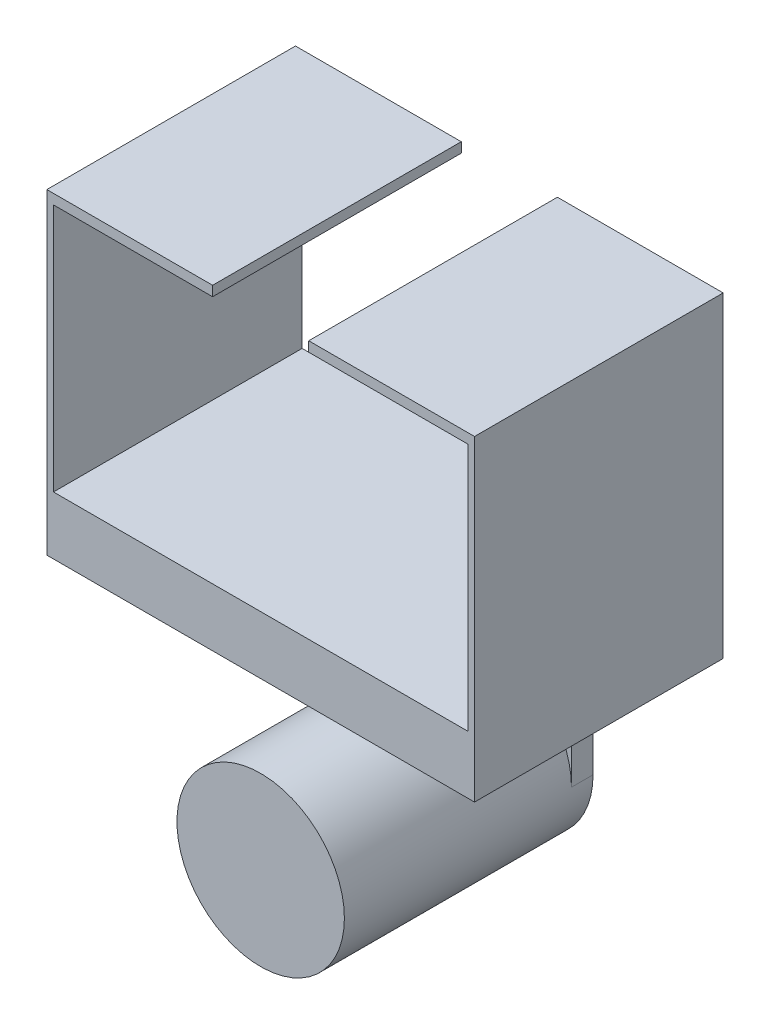
ISO-10303-21;
HEADER;
FILE_DESCRIPTION(('STEP AP214'),'2;1');
FILE_NAME('part.step','',(''),(''),'','','');
FILE_SCHEMA(('AUTOMOTIVE_DESIGN { 1 0 10303 214 1 1 1 1 }'));
ENDSEC;
DATA;
#1=APPLICATION_CONTEXT('core data for automotive mechanical design processes');
#2=APPLICATION_PROTOCOL_DEFINITION('international standard','automotive_design',2000,#1);
#3=PRODUCT_CONTEXT('',#1,'mechanical');
#4=PRODUCT('Part','Part','',(#3));
#5=PRODUCT_RELATED_PRODUCT_CATEGORY('part','',(#4));
#6=PRODUCT_DEFINITION_FORMATION('','',#4);
#7=PRODUCT_DEFINITION_CONTEXT('part definition',#1,'design');
#8=PRODUCT_DEFINITION('design','',#6,#7);
#9=PRODUCT_DEFINITION_SHAPE('','',#8);
#10=(LENGTH_UNIT() NAMED_UNIT(*) SI_UNIT(.MILLI.,.METRE.));
#11=(NAMED_UNIT(*) PLANE_ANGLE_UNIT() SI_UNIT($,.RADIAN.));
#12=(NAMED_UNIT(*) SI_UNIT($,.STERADIAN.) SOLID_ANGLE_UNIT());
#13=UNCERTAINTY_MEASURE_WITH_UNIT(LENGTH_MEASURE(1.E-05),#10,'distance_accuracy_value','');
#14=(GEOMETRIC_REPRESENTATION_CONTEXT(3) GLOBAL_UNCERTAINTY_ASSIGNED_CONTEXT((#13)) GLOBAL_UNIT_ASSIGNED_CONTEXT((#10,
#11,#12)) REPRESENTATION_CONTEXT('',''));
#15=CARTESIAN_POINT('',(0.,0.,0.));
#16=DIRECTION('',(0.,0.,1.));
#17=DIRECTION('',(1.,0.,0.));
#18=AXIS2_PLACEMENT_3D('',#15,#16,#17);
#19=CARTESIAN_POINT('',(0.,-30.1017640511618,38.1));
#20=DIRECTION('',(0.,0.,-1.));
#21=DIRECTION('',(-1.,0.,0.));
#22=AXIS2_PLACEMENT_3D('',#19,#20,#21);
#23=CYLINDRICAL_SURFACE('',#22,12.827);
#24=CARTESIAN_POINT('',(0.,-30.1017640511618,38.1));
#25=DIRECTION('',(0.,0.,1.));
#26=DIRECTION('',(1.,0.,0.));
#27=AXIS2_PLACEMENT_3D('',#24,#25,#26);
#28=CIRCLE('',#27,12.827);
#29=CARTESIAN_POINT('',(12.827,-30.1017640511618,38.1));
#30=VERTEX_POINT('',#29);
#31=EDGE_CURVE('E55',#30,#30,#28,.T.);
#32=ORIENTED_EDGE('',*,*,#31,.F.);
#33=EDGE_LOOP('',(#32));
#34=FACE_BOUND('',#33,.T.);
#35=DIRECTION('',(0.,0.,-1.));
#36=VECTOR('',#35,1.);
#37=CARTESIAN_POINT('',(-12.827,-30.1017640511618,3.302));
#38=LINE('',#37,#36);
#39=CARTESIAN_POINT('',(-12.827,-30.1017640511618,3.302));
#40=VERTEX_POINT('',#39);
#41=CARTESIAN_POINT('',(-12.827,-30.1017640511618,0.));
#42=VERTEX_POINT('',#41);
#43=EDGE_CURVE('E327',#40,#42,#38,.T.);
#44=ORIENTED_EDGE('',*,*,#43,.T.);
#45=CARTESIAN_POINT('',(0.,-30.1017640511618,0.));
#46=DIRECTION('',(0.,0.,1.));
#47=DIRECTION('',(1.,0.,0.));
#48=AXIS2_PLACEMENT_3D('',#45,#46,#47);
#49=CIRCLE('',#48,12.827);
#50=CARTESIAN_POINT('',(12.827,-30.1017640511618,0.));
#51=VERTEX_POINT('',#50);
#52=EDGE_CURVE('E330',#42,#51,#49,.T.);
#53=ORIENTED_EDGE('',*,*,#52,.T.);
#54=DIRECTION('',(0.,0.,-1.));
#55=VECTOR('',#54,1.);
#56=CARTESIAN_POINT('',(12.827,-30.1017640511618,3.302));
#57=LINE('',#56,#55);
#58=CARTESIAN_POINT('',(12.827,-30.1017640511618,3.302));
#59=VERTEX_POINT('',#58);
#60=EDGE_CURVE('E62',#59,#51,#57,.T.);
#61=ORIENTED_EDGE('',*,*,#60,.F.);
#62=CARTESIAN_POINT('',(0.,-30.1017640511618,3.302));
#63=DIRECTION('',(0.,0.,-1.));
#64=DIRECTION('',(-1.,0.,0.));
#65=AXIS2_PLACEMENT_3D('',#62,#63,#64);
#66=CIRCLE('',#65,12.827);
#67=EDGE_CURVE('E11',#40,#59,#66,.T.);
#68=ORIENTED_EDGE('',*,*,#67,.F.);
#69=EDGE_LOOP('',(#44,#53,#61,#68));
#70=FACE_BOUND('',#69,.T.);
#71=ADVANCED_FACE('F47',(#34,#70),#23,.T.);
#72=CARTESIAN_POINT('',(0.,-30.1017640511618,38.1));
#73=DIRECTION('',(0.,0.,1.));
#74=DIRECTION('',(1.,0.,0.));
#75=AXIS2_PLACEMENT_3D('',#72,#73,#74);
#76=PLANE('',#75);
#77=ORIENTED_EDGE('',*,*,#31,.T.);
#78=EDGE_LOOP('',(#77));
#79=FACE_BOUND('',#78,.T.);
#80=ADVANCED_FACE('F497',(#79),#76,.T.);
#81=CARTESIAN_POINT('',(0.,-30.1017640511618,0.));
#82=DIRECTION('',(0.,0.,1.));
#83=DIRECTION('',(1.,0.,0.));
#84=AXIS2_PLACEMENT_3D('',#81,#82,#83);
#85=PLANE('',#84);
#86=ORIENTED_EDGE('',*,*,#52,.F.);
#87=DIRECTION('',(0.,-1.,0.));
#88=VECTOR('',#87,1.);
#89=CARTESIAN_POINT('',(-12.827,-30.1017640511618,0.));
#90=LINE('',#89,#88);
#91=CARTESIAN_POINT('',(-12.827,-4.70176405116185,0.));
#92=VERTEX_POINT('',#91);
#93=EDGE_CURVE('E296',#92,#42,#90,.T.);
#94=ORIENTED_EDGE('',*,*,#93,.F.);
#95=DIRECTION('',(-1.,0.,0.));
#96=VECTOR('',#95,1.);
#97=CARTESIAN_POINT('',(-31.75,-4.70176405116185,0.));
#98=LINE('',#97,#96);
#99=CARTESIAN_POINT('',(-32.766,-4.70176405116185,0.));
#100=VERTEX_POINT('',#99);
#101=EDGE_CURVE('E299',#92,#100,#98,.T.);
#102=ORIENTED_EDGE('',*,*,#101,.T.);
#103=DIRECTION('',(0.,-1.,0.));
#104=VECTOR('',#103,1.);
#105=CARTESIAN_POINT('',(-32.766,-4.70176405116185,0.));
#106=LINE('',#105,#104);
#107=CARTESIAN_POINT('',(-32.766,43.8122359488382,0.));
#108=VERTEX_POINT('',#107);
#109=EDGE_CURVE('E168',#108,#100,#106,.T.);
#110=ORIENTED_EDGE('',*,*,#109,.F.);
#111=DIRECTION('',(-1.,0.,0.));
#112=VECTOR('',#111,1.);
#113=CARTESIAN_POINT('',(-32.766,43.8122359488382,0.));
#114=LINE('',#113,#112);
#115=CARTESIAN_POINT('',(-7.366,43.8122359488382,0.));
#116=VERTEX_POINT('',#115);
#117=EDGE_CURVE('E184',#116,#108,#114,.T.);
#118=ORIENTED_EDGE('',*,*,#117,.F.);
#119=DIRECTION('',(0.,-1.,0.));
#120=VECTOR('',#119,1.);
#121=CARTESIAN_POINT('',(-7.366,43.8122359488382,0.));
#122=LINE('',#121,#120);
#123=CARTESIAN_POINT('',(-7.366,42.2882359488382,0.));
#124=VERTEX_POINT('',#123);
#125=EDGE_CURVE('E199',#116,#124,#122,.T.);
#126=ORIENTED_EDGE('',*,*,#125,.T.);
#127=DIRECTION('',(-1.,0.,0.));
#128=VECTOR('',#127,1.);
#129=CARTESIAN_POINT('',(-32.766,42.2882359488382,0.));
#130=LINE('',#129,#128);
#131=CARTESIAN_POINT('',(-31.75,42.2882359488382,0.));
#132=VERTEX_POINT('',#131);
#133=EDGE_CURVE('E186',#124,#132,#130,.T.);
#134=ORIENTED_EDGE('',*,*,#133,.T.);
#135=DIRECTION('',(0.,-1.,0.));
#136=VECTOR('',#135,1.);
#137=CARTESIAN_POINT('',(-31.75,-4.70176405116185,0.));
#138=LINE('',#137,#136);
#139=CARTESIAN_POINT('',(-31.75,4.18823594883815,0.));
#140=VERTEX_POINT('',#139);
#141=EDGE_CURVE('E169',#132,#140,#138,.T.);
#142=ORIENTED_EDGE('',*,*,#141,.T.);
#143=DIRECTION('',(-1.,0.,0.));
#144=VECTOR('',#143,1.);
#145=CARTESIAN_POINT('',(-31.75,4.18823594883815,0.));
#146=LINE('',#145,#144);
#147=CARTESIAN_POINT('',(31.75,4.18823594883815,0.));
#148=VERTEX_POINT('',#147);
#149=EDGE_CURVE('E292',#148,#140,#146,.T.);
#150=ORIENTED_EDGE('',*,*,#149,.F.);
#151=DIRECTION('',(0.,1.,0.));
#152=VECTOR('',#151,1.);
#153=CARTESIAN_POINT('',(31.75,-4.70176405116185,0.));
#154=LINE('',#153,#152);
#155=CARTESIAN_POINT('',(31.75,42.2882359488382,0.));
#156=VERTEX_POINT('',#155);
#157=EDGE_CURVE('E273',#148,#156,#154,.T.);
#158=ORIENTED_EDGE('',*,*,#157,.T.);
#159=DIRECTION('',(-1.,0.,0.));
#160=VECTOR('',#159,1.);
#161=CARTESIAN_POINT('',(32.766,42.2882359488382,0.));
#162=LINE('',#161,#160);
#163=CARTESIAN_POINT('',(7.36600000000001,42.2882359488382,0.));
#164=VERTEX_POINT('',#163);
#165=EDGE_CURVE('E210',#156,#164,#162,.T.);
#166=ORIENTED_EDGE('',*,*,#165,.T.);
#167=DIRECTION('',(0.,-1.,0.));
#168=VECTOR('',#167,1.);
#169=CARTESIAN_POINT('',(7.36600000000001,43.8122359488382,0.));
#170=LINE('',#169,#168);
#171=CARTESIAN_POINT('',(7.36600000000001,43.8122359488382,0.));
#172=VERTEX_POINT('',#171);
#173=EDGE_CURVE('E238',#172,#164,#170,.T.);
#174=ORIENTED_EDGE('',*,*,#173,.F.);
#175=DIRECTION('',(-1.,0.,0.));
#176=VECTOR('',#175,1.);
#177=CARTESIAN_POINT('',(32.766,43.8122359488382,0.));
#178=LINE('',#177,#176);
#179=CARTESIAN_POINT('',(32.766,43.8122359488382,0.));
#180=VERTEX_POINT('',#179);
#181=EDGE_CURVE('E215',#180,#172,#178,.T.);
#182=ORIENTED_EDGE('',*,*,#181,.F.);
#183=DIRECTION('',(0.,1.,0.));
#184=VECTOR('',#183,1.);
#185=CARTESIAN_POINT('',(32.766,-4.70176405116185,0.));
#186=LINE('',#185,#184);
#187=CARTESIAN_POINT('',(32.766,-4.70176405116185,0.));
#188=VERTEX_POINT('',#187);
#189=EDGE_CURVE('E266',#188,#180,#186,.T.);
#190=ORIENTED_EDGE('',*,*,#189,.F.);
#191=CARTESIAN_POINT('',(12.827,-4.70176405116185,0.));
#192=VERTEX_POINT('',#191);
#193=EDGE_CURVE('E284',#188,#192,#98,.T.);
#194=ORIENTED_EDGE('',*,*,#193,.T.);
#195=DIRECTION('',(0.,1.,0.));
#196=VECTOR('',#195,1.);
#197=CARTESIAN_POINT('',(12.827,-30.1017640511618,0.));
#198=LINE('',#197,#196);
#199=EDGE_CURVE('E307',#51,#192,#198,.T.);
#200=ORIENTED_EDGE('',*,*,#199,.F.);
#201=EDGE_LOOP('',(#86,#94,#102,#110,#118,#126,#134,#142,#150,#158,#166,#174,#182,#190,#194,#200));
#202=FACE_BOUND('',#201,.T.);
#203=ADVANCED_FACE('F344',(#202),#85,.F.);
#204=CARTESIAN_POINT('',(-12.827,-30.1017640511618,3.302));
#205=DIRECTION('',(1.,0.,0.));
#206=DIRECTION('',(0.,0.,-1.));
#207=AXIS2_PLACEMENT_3D('',#204,#205,#206);
#208=PLANE('',#207);
#209=ORIENTED_EDGE('',*,*,#93,.T.);
#210=ORIENTED_EDGE('',*,*,#43,.F.);
#211=DIRECTION('',(0.,-1.,0.));
#212=VECTOR('',#211,1.);
#213=CARTESIAN_POINT('',(-12.827,-30.1017640511618,3.302));
#214=LINE('',#213,#212);
#215=CARTESIAN_POINT('',(-12.827,-4.70176405116185,3.302));
#216=VERTEX_POINT('',#215);
#217=EDGE_CURVE('E303',#216,#40,#214,.T.);
#218=ORIENTED_EDGE('',*,*,#217,.F.);
#219=DIRECTION('',(0.,0.,-1.));
#220=VECTOR('',#219,1.);
#221=CARTESIAN_POINT('',(-12.827,-4.70176405116185,3.302));
#222=LINE('',#221,#220);
#223=EDGE_CURVE('E313',#216,#92,#222,.T.);
#224=ORIENTED_EDGE('',*,*,#223,.T.);
#225=EDGE_LOOP('',(#209,#210,#218,#224));
#226=FACE_BOUND('',#225,.T.);
#227=ADVANCED_FACE('F484',(#226),#208,.F.);
#228=CARTESIAN_POINT('',(12.827,-30.1017640511618,3.302));
#229=DIRECTION('',(-1.,0.,0.));
#230=DIRECTION('',(0.,0.,1.));
#231=AXIS2_PLACEMENT_3D('',#228,#229,#230);
#232=PLANE('',#231);
#233=ORIENTED_EDGE('',*,*,#199,.T.);
#234=DIRECTION('',(0.,0.,-1.));
#235=VECTOR('',#234,1.);
#236=CARTESIAN_POINT('',(12.827,-4.70176405116185,3.302));
#237=LINE('',#236,#235);
#238=CARTESIAN_POINT('',(12.827,-4.70176405116185,3.302));
#239=VERTEX_POINT('',#238);
#240=EDGE_CURVE('E321',#239,#192,#237,.T.);
#241=ORIENTED_EDGE('',*,*,#240,.F.);
#242=DIRECTION('',(0.,1.,0.));
#243=VECTOR('',#242,1.);
#244=CARTESIAN_POINT('',(12.827,-30.1017640511618,3.302));
#245=LINE('',#244,#243);
#246=EDGE_CURVE('E306',#59,#239,#245,.T.);
#247=ORIENTED_EDGE('',*,*,#246,.F.);
#248=ORIENTED_EDGE('',*,*,#60,.T.);
#249=EDGE_LOOP('',(#233,#241,#247,#248));
#250=FACE_BOUND('',#249,.T.);
#251=ADVANCED_FACE('F342',(#250),#232,.F.);
#252=CARTESIAN_POINT('',(0.,0.,3.302));
#253=DIRECTION('',(0.,0.,-1.));
#254=DIRECTION('',(-1.,0.,0.));
#255=AXIS2_PLACEMENT_3D('',#252,#253,#254);
#256=PLANE('',#255);
#257=ORIENTED_EDGE('',*,*,#217,.T.);
#258=ORIENTED_EDGE('',*,*,#67,.T.);
#259=ORIENTED_EDGE('',*,*,#246,.T.);
#260=DIRECTION('',(-1.,0.,0.));
#261=VECTOR('',#260,1.);
#262=CARTESIAN_POINT('',(-12.827,-4.70176405116185,3.302));
#263=LINE('',#262,#261);
#264=EDGE_CURVE('E310',#239,#216,#263,.T.);
#265=ORIENTED_EDGE('',*,*,#264,.T.);
#266=EDGE_LOOP('',(#257,#258,#259,#265));
#267=FACE_BOUND('',#266,.T.);
#268=ADVANCED_FACE('F486',(#267),#256,.F.);
#269=CARTESIAN_POINT('',(-31.75,4.18823594883815,38.1));
#270=DIRECTION('',(0.,0.,-1.));
#271=DIRECTION('',(-1.,0.,0.));
#272=AXIS2_PLACEMENT_3D('',#269,#270,#271);
#273=PLANE('',#272);
#274=DIRECTION('',(1.,0.,0.));
#275=VECTOR('',#274,1.);
#276=CARTESIAN_POINT('',(-31.75,-4.70176405116185,38.1));
#277=LINE('',#276,#275);
#278=CARTESIAN_POINT('',(-32.766,-4.70176405116185,38.1));
#279=VERTEX_POINT('',#278);
#280=CARTESIAN_POINT('',(32.766,-4.70176405116185,38.1));
#281=VERTEX_POINT('',#280);
#282=EDGE_CURVE('E269',#279,#281,#277,.T.);
#283=ORIENTED_EDGE('',*,*,#282,.T.);
#284=DIRECTION('',(0.,-1.,0.));
#285=VECTOR('',#284,1.);
#286=CARTESIAN_POINT('',(32.766,-4.70176405116185,38.1));
#287=LINE('',#286,#285);
#288=CARTESIAN_POINT('',(32.766,43.8122359488382,38.1));
#289=VERTEX_POINT('',#288);
#290=EDGE_CURVE('E257',#289,#281,#287,.T.);
#291=ORIENTED_EDGE('',*,*,#290,.F.);
#292=DIRECTION('',(1.,0.,0.));
#293=VECTOR('',#292,1.);
#294=CARTESIAN_POINT('',(32.766,43.8122359488382,38.1));
#295=LINE('',#294,#293);
#296=CARTESIAN_POINT('',(7.36600000000002,43.8122359488382,38.1));
#297=VERTEX_POINT('',#296);
#298=EDGE_CURVE('E222',#297,#289,#295,.T.);
#299=ORIENTED_EDGE('',*,*,#298,.F.);
#300=DIRECTION('',(0.,-1.,0.));
#301=VECTOR('',#300,1.);
#302=CARTESIAN_POINT('',(7.36600000000002,43.8122359488382,38.1));
#303=LINE('',#302,#301);
#304=CARTESIAN_POINT('',(7.36600000000002,42.2882359488382,38.1));
#305=VERTEX_POINT('',#304);
#306=EDGE_CURVE('E226',#297,#305,#303,.T.);
#307=ORIENTED_EDGE('',*,*,#306,.T.);
#308=DIRECTION('',(1.,0.,0.));
#309=VECTOR('',#308,1.);
#310=CARTESIAN_POINT('',(32.766,42.2882359488382,38.1));
#311=LINE('',#310,#309);
#312=CARTESIAN_POINT('',(31.75,42.2882359488382,38.1));
#313=VERTEX_POINT('',#312);
#314=EDGE_CURVE('E216',#305,#313,#311,.T.);
#315=ORIENTED_EDGE('',*,*,#314,.T.);
#316=DIRECTION('',(0.,-1.,0.));
#317=VECTOR('',#316,1.);
#318=CARTESIAN_POINT('',(31.75,-4.70176405116185,38.1));
#319=LINE('',#318,#317);
#320=CARTESIAN_POINT('',(31.75,4.18823594883815,38.1));
#321=VERTEX_POINT('',#320);
#322=EDGE_CURVE('E247',#313,#321,#319,.T.);
#323=ORIENTED_EDGE('',*,*,#322,.T.);
#324=DIRECTION('',(1.,0.,0.));
#325=VECTOR('',#324,1.);
#326=CARTESIAN_POINT('',(-31.75,4.18823594883815,38.1));
#327=LINE('',#326,#325);
#328=CARTESIAN_POINT('',(-31.75,4.18823594883815,38.1));
#329=VERTEX_POINT('',#328);
#330=EDGE_CURVE('E283',#329,#321,#327,.T.);
#331=ORIENTED_EDGE('',*,*,#330,.F.);
#332=DIRECTION('',(0.,1.,0.));
#333=VECTOR('',#332,1.);
#334=CARTESIAN_POINT('',(-31.75,-4.70176405116185,38.1));
#335=LINE('',#334,#333);
#336=CARTESIAN_POINT('',(-31.75,42.2882359488382,38.1));
#337=VERTEX_POINT('',#336);
#338=EDGE_CURVE('E241',#329,#337,#335,.T.);
#339=ORIENTED_EDGE('',*,*,#338,.T.);
#340=DIRECTION('',(1.,0.,0.));
#341=VECTOR('',#340,1.);
#342=CARTESIAN_POINT('',(-32.766,42.2882359488381,38.1));
#343=LINE('',#342,#341);
#344=CARTESIAN_POINT('',(-7.366,42.2882359488381,38.1));
#345=VERTEX_POINT('',#344);
#346=EDGE_CURVE('E200',#337,#345,#343,.T.);
#347=ORIENTED_EDGE('',*,*,#346,.T.);
#348=DIRECTION('',(0.,-1.,0.));
#349=VECTOR('',#348,1.);
#350=CARTESIAN_POINT('',(-7.366,43.8122359488381,38.1));
#351=LINE('',#350,#349);
#352=CARTESIAN_POINT('',(-7.366,43.8122359488381,38.1));
#353=VERTEX_POINT('',#352);
#354=EDGE_CURVE('E175',#353,#345,#351,.T.);
#355=ORIENTED_EDGE('',*,*,#354,.F.);
#356=DIRECTION('',(1.,0.,0.));
#357=VECTOR('',#356,1.);
#358=CARTESIAN_POINT('',(-32.766,43.8122359488381,38.1));
#359=LINE('',#358,#357);
#360=CARTESIAN_POINT('',(-32.766,43.8122359488381,38.1));
#361=VERTEX_POINT('',#360);
#362=EDGE_CURVE('E172',#361,#353,#359,.T.);
#363=ORIENTED_EDGE('',*,*,#362,.F.);
#364=DIRECTION('',(0.,1.,0.));
#365=VECTOR('',#364,1.);
#366=CARTESIAN_POINT('',(-32.766,-4.70176405116185,38.1));
#367=LINE('',#366,#365);
#368=EDGE_CURVE('E158',#279,#361,#367,.T.);
#369=ORIENTED_EDGE('',*,*,#368,.F.);
#370=EDGE_LOOP('',(#283,#291,#299,#307,#315,#323,#331,#339,#347,#355,#363,#369));
#371=FACE_BOUND('',#370,.T.);
#372=ADVANCED_FACE('F173',(#371),#273,.F.);
#373=CARTESIAN_POINT('',(0.,4.18823594883815,0.));
#374=DIRECTION('',(0.,1.,0.));
#375=DIRECTION('',(0.,0.,1.));
#376=AXIS2_PLACEMENT_3D('',#373,#374,#375);
#377=PLANE('',#376);
#378=DIRECTION('',(0.,0.,1.));
#379=VECTOR('',#378,1.);
#380=CARTESIAN_POINT('',(-31.75,4.18823594883815,0.));
#381=LINE('',#380,#379);
#382=EDGE_CURVE('E279',#140,#329,#381,.T.);
#383=ORIENTED_EDGE('',*,*,#382,.T.);
#384=ORIENTED_EDGE('',*,*,#330,.T.);
#385=DIRECTION('',(0.,0.,-1.));
#386=VECTOR('',#385,1.);
#387=CARTESIAN_POINT('',(31.75,4.18823594883815,0.));
#388=LINE('',#387,#386);
#389=EDGE_CURVE('E288',#321,#148,#388,.T.);
#390=ORIENTED_EDGE('',*,*,#389,.T.);
#391=ORIENTED_EDGE('',*,*,#149,.T.);
#392=EDGE_LOOP('',(#383,#384,#390,#391));
#393=FACE_BOUND('',#392,.T.);
#394=ADVANCED_FACE('F373',(#393),#377,.T.);
#395=CARTESIAN_POINT('',(0.,-4.70176405116185,0.));
#396=DIRECTION('',(0.,1.,0.));
#397=DIRECTION('',(0.,0.,1.));
#398=AXIS2_PLACEMENT_3D('',#395,#396,#397);
#399=PLANE('',#398);
#400=ORIENTED_EDGE('',*,*,#223,.F.);
#401=ORIENTED_EDGE('',*,*,#264,.F.);
#402=ORIENTED_EDGE('',*,*,#240,.T.);
#403=ORIENTED_EDGE('',*,*,#193,.F.);
#404=DIRECTION('',(0.,0.,-1.));
#405=VECTOR('',#404,1.);
#406=CARTESIAN_POINT('',(32.766,-4.70176405116185,38.1));
#407=LINE('',#406,#405);
#408=EDGE_CURVE('E261',#281,#188,#407,.T.);
#409=ORIENTED_EDGE('',*,*,#408,.F.);
#410=ORIENTED_EDGE('',*,*,#282,.F.);
#411=DIRECTION('',(0.,0.,1.));
#412=VECTOR('',#411,1.);
#413=CARTESIAN_POINT('',(-32.766,-4.70176405116185,38.1));
#414=LINE('',#413,#412);
#415=EDGE_CURVE('E165',#100,#279,#414,.T.);
#416=ORIENTED_EDGE('',*,*,#415,.F.);
#417=ORIENTED_EDGE('',*,*,#101,.F.);
#418=EDGE_LOOP('',(#400,#401,#402,#403,#409,#410,#416,#417));
#419=FACE_BOUND('',#418,.T.);
#420=ADVANCED_FACE('F350',(#419),#399,.F.);
#421=CARTESIAN_POINT('',(31.75,0.,0.));
#422=DIRECTION('',(-1.,0.,0.));
#423=DIRECTION('',(0.,0.,1.));
#424=AXIS2_PLACEMENT_3D('',#421,#422,#423);
#425=PLANE('',#424);
#426=ORIENTED_EDGE('',*,*,#389,.F.);
#427=ORIENTED_EDGE('',*,*,#322,.F.);
#428=DIRECTION('',(0.,0.,1.));
#429=VECTOR('',#428,1.);
#430=CARTESIAN_POINT('',(31.75,42.2882359488382,38.1));
#431=LINE('',#430,#429);
#432=EDGE_CURVE('E262',#156,#313,#431,.T.);
#433=ORIENTED_EDGE('',*,*,#432,.F.);
#434=ORIENTED_EDGE('',*,*,#157,.F.);
#435=EDGE_LOOP('',(#426,#427,#433,#434));
#436=FACE_BOUND('',#435,.T.);
#437=ADVANCED_FACE('F370',(#436),#425,.T.);
#438=CARTESIAN_POINT('',(32.766,0.,0.));
#439=DIRECTION('',(-1.,0.,0.));
#440=DIRECTION('',(0.,0.,1.));
#441=AXIS2_PLACEMENT_3D('',#438,#439,#440);
#442=PLANE('',#441);
#443=ORIENTED_EDGE('',*,*,#290,.T.);
#444=ORIENTED_EDGE('',*,*,#408,.T.);
#445=ORIENTED_EDGE('',*,*,#189,.T.);
#446=DIRECTION('',(0.,0.,-1.));
#447=VECTOR('',#446,1.);
#448=CARTESIAN_POINT('',(32.766,43.8122359488382,38.1));
#449=LINE('',#448,#447);
#450=EDGE_CURVE('E211',#289,#180,#449,.T.);
#451=ORIENTED_EDGE('',*,*,#450,.F.);
#452=EDGE_LOOP('',(#443,#444,#445,#451));
#453=FACE_BOUND('',#452,.T.);
#454=ADVANCED_FACE('F353',(#453),#442,.F.);
#455=CARTESIAN_POINT('',(-32.766,0.,0.));
#456=DIRECTION('',(-1.,0.,0.));
#457=DIRECTION('',(0.,0.,1.));
#458=AXIS2_PLACEMENT_3D('',#455,#456,#457);
#459=PLANE('',#458);
#460=ORIENTED_EDGE('',*,*,#368,.T.);
#461=DIRECTION('',(0.,0.,1.));
#462=VECTOR('',#461,1.);
#463=CARTESIAN_POINT('',(-32.766,43.8122359488381,38.1));
#464=LINE('',#463,#462);
#465=EDGE_CURVE('E163',#108,#361,#464,.T.);
#466=ORIENTED_EDGE('',*,*,#465,.F.);
#467=ORIENTED_EDGE('',*,*,#109,.T.);
#468=ORIENTED_EDGE('',*,*,#415,.T.);
#469=EDGE_LOOP('',(#460,#466,#467,#468));
#470=FACE_BOUND('',#469,.T.);
#471=ADVANCED_FACE('F160',(#470),#459,.T.);
#472=CARTESIAN_POINT('',(-31.75,0.,0.));
#473=DIRECTION('',(-1.,0.,0.));
#474=DIRECTION('',(0.,0.,1.));
#475=AXIS2_PLACEMENT_3D('',#472,#473,#474);
#476=PLANE('',#475);
#477=ORIENTED_EDGE('',*,*,#382,.F.);
#478=ORIENTED_EDGE('',*,*,#141,.F.);
#479=DIRECTION('',(0.,0.,-1.));
#480=VECTOR('',#479,1.);
#481=CARTESIAN_POINT('',(-31.75,42.2882359488382,38.1));
#482=LINE('',#481,#480);
#483=EDGE_CURVE('E250',#337,#132,#482,.T.);
#484=ORIENTED_EDGE('',*,*,#483,.F.);
#485=ORIENTED_EDGE('',*,*,#338,.F.);
#486=EDGE_LOOP('',(#477,#478,#484,#485));
#487=FACE_BOUND('',#486,.T.);
#488=ADVANCED_FACE('F376',(#487),#476,.F.);
#489=CARTESIAN_POINT('',(7.36600000000002,43.8122359488382,38.1));
#490=DIRECTION('',(1.,0.,0.));
#491=DIRECTION('',(0.,0.,-1.));
#492=AXIS2_PLACEMENT_3D('',#489,#490,#491);
#493=PLANE('',#492);
#494=DIRECTION('',(0.,0.,1.));
#495=VECTOR('',#494,1.);
#496=CARTESIAN_POINT('',(7.36600000000002,42.2882359488382,38.1));
#497=LINE('',#496,#495);
#498=EDGE_CURVE('E229',#164,#305,#497,.T.);
#499=ORIENTED_EDGE('',*,*,#498,.T.);
#500=ORIENTED_EDGE('',*,*,#306,.F.);
#501=DIRECTION('',(0.,0.,1.));
#502=VECTOR('',#501,1.);
#503=CARTESIAN_POINT('',(7.36600000000002,43.8122359488382,38.1));
#504=LINE('',#503,#502);
#505=EDGE_CURVE('E219',#172,#297,#504,.T.);
#506=ORIENTED_EDGE('',*,*,#505,.F.);
#507=ORIENTED_EDGE('',*,*,#173,.T.);
#508=EDGE_LOOP('',(#499,#500,#506,#507));
#509=FACE_BOUND('',#508,.T.);
#510=ADVANCED_FACE('F362',(#509),#493,.F.);
#511=CARTESIAN_POINT('',(0.,43.8122359488382,0.));
#512=DIRECTION('',(0.,1.,0.));
#513=DIRECTION('',(0.,0.,1.));
#514=AXIS2_PLACEMENT_3D('',#511,#512,#513);
#515=PLANE('',#514);
#516=ORIENTED_EDGE('',*,*,#450,.T.);
#517=ORIENTED_EDGE('',*,*,#181,.T.);
#518=ORIENTED_EDGE('',*,*,#505,.T.);
#519=ORIENTED_EDGE('',*,*,#298,.T.);
#520=EDGE_LOOP('',(#516,#517,#518,#519));
#521=FACE_BOUND('',#520,.T.);
#522=ADVANCED_FACE('F357',(#521),#515,.T.);
#523=CARTESIAN_POINT('',(0.,42.2882359488382,0.));
#524=DIRECTION('',(0.,1.,0.));
#525=DIRECTION('',(0.,0.,1.));
#526=AXIS2_PLACEMENT_3D('',#523,#524,#525);
#527=PLANE('',#526);
#528=ORIENTED_EDGE('',*,*,#432,.T.);
#529=ORIENTED_EDGE('',*,*,#314,.F.);
#530=ORIENTED_EDGE('',*,*,#498,.F.);
#531=ORIENTED_EDGE('',*,*,#165,.F.);
#532=EDGE_LOOP('',(#528,#529,#530,#531));
#533=FACE_BOUND('',#532,.T.);
#534=ADVANCED_FACE('F367',(#533),#527,.F.);
#535=CARTESIAN_POINT('',(0.,42.2882359488382,0.));
#536=DIRECTION('',(0.,-1.,0.));
#537=DIRECTION('',(0.,0.,-1.));
#538=AXIS2_PLACEMENT_3D('',#535,#536,#537);
#539=PLANE('',#538);
#540=ORIENTED_EDGE('',*,*,#483,.T.);
#541=ORIENTED_EDGE('',*,*,#133,.F.);
#542=DIRECTION('',(0.,0.,-1.));
#543=VECTOR('',#542,1.);
#544=CARTESIAN_POINT('',(-7.366,42.2882359488381,38.1));
#545=LINE('',#544,#543);
#546=EDGE_CURVE('E192',#345,#124,#545,.T.);
#547=ORIENTED_EDGE('',*,*,#546,.F.);
#548=ORIENTED_EDGE('',*,*,#346,.F.);
#549=EDGE_LOOP('',(#540,#541,#547,#548));
#550=FACE_BOUND('',#549,.T.);
#551=ADVANCED_FACE('F382',(#550),#539,.T.);
#552=CARTESIAN_POINT('',(-7.366,43.8122359488381,38.1));
#553=DIRECTION('',(-1.,0.,0.));
#554=DIRECTION('',(0.,0.,1.));
#555=AXIS2_PLACEMENT_3D('',#552,#553,#554);
#556=PLANE('',#555);
#557=ORIENTED_EDGE('',*,*,#546,.T.);
#558=ORIENTED_EDGE('',*,*,#125,.F.);
#559=DIRECTION('',(0.,0.,-1.));
#560=VECTOR('',#559,1.);
#561=CARTESIAN_POINT('',(-7.366,43.8122359488381,38.1));
#562=LINE('',#561,#560);
#563=EDGE_CURVE('E179',#353,#116,#562,.T.);
#564=ORIENTED_EDGE('',*,*,#563,.F.);
#565=ORIENTED_EDGE('',*,*,#354,.T.);
#566=EDGE_LOOP('',(#557,#558,#564,#565));
#567=FACE_BOUND('',#566,.T.);
#568=ADVANCED_FACE('F385',(#567),#556,.F.);
#569=CARTESIAN_POINT('',(0.,43.8122359488382,0.));
#570=DIRECTION('',(0.,-1.,0.));
#571=DIRECTION('',(0.,0.,-1.));
#572=AXIS2_PLACEMENT_3D('',#569,#570,#571);
#573=PLANE('',#572);
#574=ORIENTED_EDGE('',*,*,#465,.T.);
#575=ORIENTED_EDGE('',*,*,#362,.T.);
#576=ORIENTED_EDGE('',*,*,#563,.T.);
#577=ORIENTED_EDGE('',*,*,#117,.T.);
#578=EDGE_LOOP('',(#574,#575,#576,#577));
#579=FACE_BOUND('',#578,.T.);
#580=ADVANCED_FACE('F182',(#579),#573,.F.);
#581=CLOSED_SHELL('',(#71,#80,#203,#227,#251,#268,#372,#394,#420,#437,#454,#471,#488,#510,#522,
#534,#551,#568,#580));
#582=MANIFOLD_SOLID_BREP('B2',#581);
#583=ADVANCED_BREP_SHAPE_REPRESENTATION('',(#18,#582),#14);
#584=SHAPE_DEFINITION_REPRESENTATION(#9,#583);
ENDSEC;
END-ISO-10303-21;
